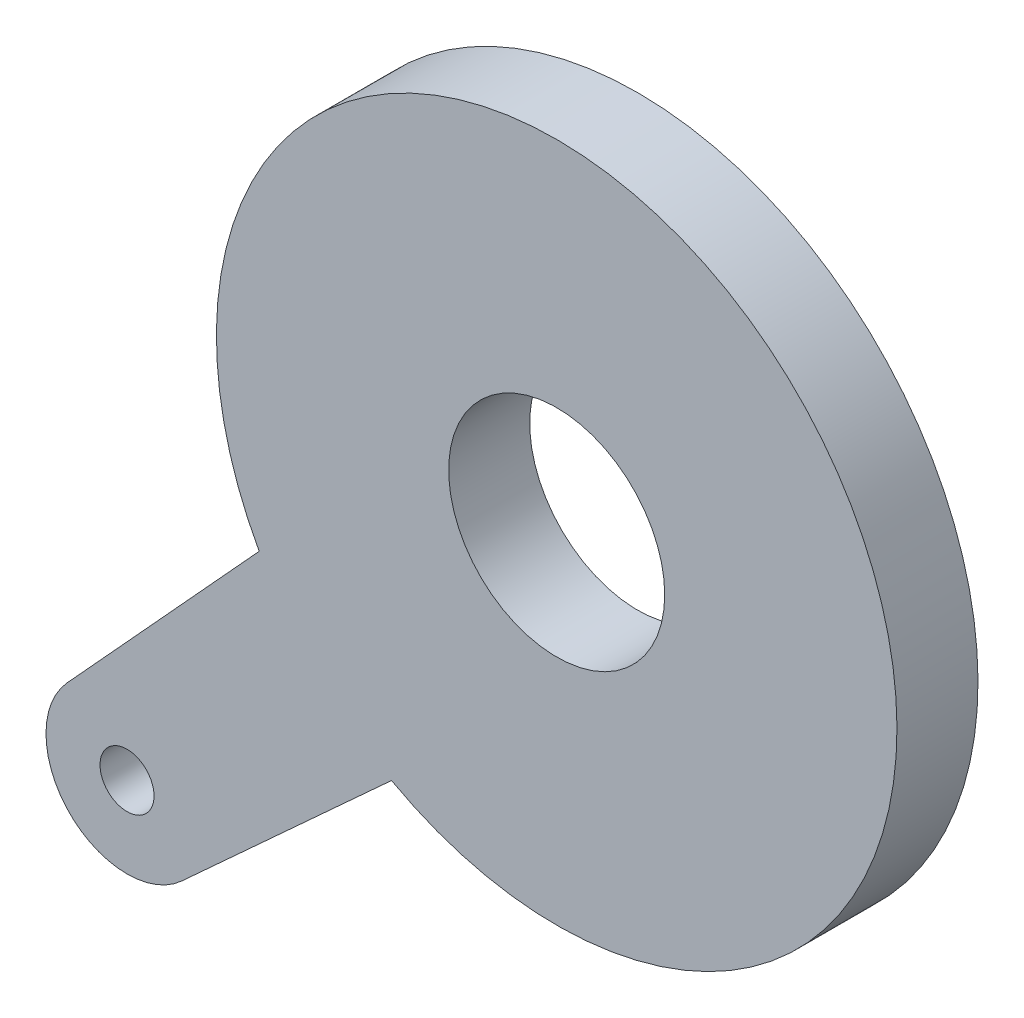
ISO-10303-21;
HEADER;
FILE_DESCRIPTION(('STEP AP214'),'2;1');
FILE_NAME('part.step','',(''),(''),'','','');
FILE_SCHEMA(('AUTOMOTIVE_DESIGN { 1 0 10303 214 1 1 1 1 }'));
ENDSEC;
DATA;
#1=APPLICATION_CONTEXT('core data for automotive mechanical design processes');
#2=APPLICATION_PROTOCOL_DEFINITION('international standard','automotive_design',2000,#1);
#3=PRODUCT_CONTEXT('',#1,'mechanical');
#4=PRODUCT('Part','Part','',(#3));
#5=PRODUCT_RELATED_PRODUCT_CATEGORY('part','',(#4));
#6=PRODUCT_DEFINITION_FORMATION('','',#4);
#7=PRODUCT_DEFINITION_CONTEXT('part definition',#1,'design');
#8=PRODUCT_DEFINITION('design','',#6,#7);
#9=PRODUCT_DEFINITION_SHAPE('','',#8);
#10=(LENGTH_UNIT() NAMED_UNIT(*) SI_UNIT(.MILLI.,.METRE.));
#11=(NAMED_UNIT(*) PLANE_ANGLE_UNIT() SI_UNIT($,.RADIAN.));
#12=(NAMED_UNIT(*) SI_UNIT($,.STERADIAN.) SOLID_ANGLE_UNIT());
#13=UNCERTAINTY_MEASURE_WITH_UNIT(LENGTH_MEASURE(1.E-05),#10,'distance_accuracy_value','');
#14=(GEOMETRIC_REPRESENTATION_CONTEXT(3) GLOBAL_UNCERTAINTY_ASSIGNED_CONTEXT((#13)) GLOBAL_UNIT_ASSIGNED_CONTEXT((#10,
#11,#12)) REPRESENTATION_CONTEXT('',''));
#15=CARTESIAN_POINT('',(0.,0.,0.));
#16=DIRECTION('',(0.,0.,1.));
#17=DIRECTION('',(1.,0.,0.));
#18=AXIS2_PLACEMENT_3D('',#15,#16,#17);
#19=CARTESIAN_POINT('',(-15.9099025766973,-15.9099025766973,3.));
#20=DIRECTION('',(0.,0.,1.));
#21=DIRECTION('',(1.,0.,0.));
#22=AXIS2_PLACEMENT_3D('',#19,#20,#21);
#23=PLANE('',#22);
#24=CARTESIAN_POINT('',(0.,0.,3.));
#25=DIRECTION('',(0.,0.,1.));
#26=DIRECTION('',(1.,0.,0.));
#27=AXIS2_PLACEMENT_3D('',#24,#25,#26);
#28=CIRCLE('',#27,4.);
#29=CARTESIAN_POINT('',(4.,0.,3.));
#30=VERTEX_POINT('',#29);
#31=EDGE_CURVE('E117',#30,#30,#28,.T.);
#32=ORIENTED_EDGE('',*,*,#31,.F.);
#33=EDGE_LOOP('',(#32));
#34=FACE_BOUND('',#33,.T.);
#35=CARTESIAN_POINT('',(-15.9099025766973,-15.9099025766973,3.));
#36=DIRECTION('',(0.,0.,1.));
#37=DIRECTION('',(1.,0.,0.));
#38=AXIS2_PLACEMENT_3D('',#35,#36,#37);
#39=CIRCLE('',#38,3.);
#40=CARTESIAN_POINT('',(-18.1234076575559,-13.8849593041552,3.));
#41=VERTEX_POINT('',#40);
#42=CARTESIAN_POINT('',(-13.8849593041552,-18.1234076575558,3.));
#43=VERTEX_POINT('',#42);
#44=EDGE_CURVE('E97',#41,#43,#39,.T.);
#45=ORIENTED_EDGE('',*,*,#44,.T.);
#46=DIRECTION('',(0.73783502695284,0.674981090847367,0.));
#47=VECTOR('',#46,1.);
#48=CARTESIAN_POINT('',(-6.11589206132728,-11.0161637739366,3.));
#49=LINE('',#48,#47);
#50=CARTESIAN_POINT('',(-6.11589206132728,-11.0161637739366,3.));
#51=VERTEX_POINT('',#50);
#52=EDGE_CURVE('E92',#43,#51,#49,.T.);
#53=ORIENTED_EDGE('',*,*,#52,.T.);
#54=CARTESIAN_POINT('',(0.,0.,3.));
#55=DIRECTION('',(0.,0.,1.));
#56=DIRECTION('',(1.,0.,0.));
#57=AXIS2_PLACEMENT_3D('',#54,#55,#56);
#58=CIRCLE('',#57,12.6);
#59=CARTESIAN_POINT('',(-11.0161637739367,-6.11589206132725,3.));
#60=VERTEX_POINT('',#59);
#61=EDGE_CURVE('E95',#51,#60,#58,.T.);
#62=ORIENTED_EDGE('',*,*,#61,.T.);
#63=DIRECTION('',(-0.674981090847369,-0.737835026952838,0.));
#64=VECTOR('',#63,1.);
#65=CARTESIAN_POINT('',(-11.0161637739367,-6.11589206132725,3.));
#66=LINE('',#65,#64);
#67=EDGE_CURVE('E62',#60,#41,#66,.T.);
#68=ORIENTED_EDGE('',*,*,#67,.T.);
#69=EDGE_LOOP('',(#45,#53,#62,#68));
#70=FACE_BOUND('',#69,.T.);
#71=CARTESIAN_POINT('',(-15.9099025766973,-15.9099025766973,3.));
#72=DIRECTION('',(0.,0.,1.));
#73=DIRECTION('',(1.,0.,0.));
#74=AXIS2_PLACEMENT_3D('',#71,#72,#73);
#75=CIRCLE('',#74,1.);
#76=CARTESIAN_POINT('',(-14.9099025766973,-15.9099025766973,3.));
#77=VERTEX_POINT('',#76);
#78=EDGE_CURVE('E139',#77,#77,#75,.T.);
#79=ORIENTED_EDGE('',*,*,#78,.F.);
#80=EDGE_LOOP('',(#79));
#81=FACE_BOUND('',#80,.T.);
#82=ADVANCED_FACE('F44',(#34,#70,#81),#23,.T.);
#83=CARTESIAN_POINT('',(-15.9099025766973,-15.9099025766973,0.));
#84=DIRECTION('',(0.,0.,1.));
#85=DIRECTION('',(1.,0.,0.));
#86=AXIS2_PLACEMENT_3D('',#83,#84,#85);
#87=PLANE('',#86);
#88=CARTESIAN_POINT('',(-15.9099025766973,-15.9099025766973,0.));
#89=DIRECTION('',(0.,0.,1.));
#90=DIRECTION('',(1.,0.,0.));
#91=AXIS2_PLACEMENT_3D('',#88,#89,#90);
#92=CIRCLE('',#91,3.);
#93=CARTESIAN_POINT('',(-18.1234076575559,-13.8849593041552,0.));
#94=VERTEX_POINT('',#93);
#95=CARTESIAN_POINT('',(-13.8849593041552,-18.1234076575558,0.));
#96=VERTEX_POINT('',#95);
#97=EDGE_CURVE('E113',#94,#96,#92,.T.);
#98=ORIENTED_EDGE('',*,*,#97,.F.);
#99=DIRECTION('',(-0.674981090847369,-0.737835026952838,0.));
#100=VECTOR('',#99,1.);
#101=CARTESIAN_POINT('',(-11.0161637739367,-6.11589206132725,0.));
#102=LINE('',#101,#100);
#103=CARTESIAN_POINT('',(-11.0161637739367,-6.11589206132725,0.));
#104=VERTEX_POINT('',#103);
#105=EDGE_CURVE('E85',#104,#94,#102,.T.);
#106=ORIENTED_EDGE('',*,*,#105,.F.);
#107=CARTESIAN_POINT('',(0.,0.,0.));
#108=DIRECTION('',(0.,0.,1.));
#109=DIRECTION('',(1.,0.,0.));
#110=AXIS2_PLACEMENT_3D('',#107,#108,#109);
#111=CIRCLE('',#110,12.6);
#112=CARTESIAN_POINT('',(-6.11589206132728,-11.0161637739366,0.));
#113=VERTEX_POINT('',#112);
#114=EDGE_CURVE('E79',#113,#104,#111,.T.);
#115=ORIENTED_EDGE('',*,*,#114,.F.);
#116=DIRECTION('',(0.73783502695284,0.674981090847367,0.));
#117=VECTOR('',#116,1.);
#118=CARTESIAN_POINT('',(-6.11589206132728,-11.0161637739366,0.));
#119=LINE('',#118,#117);
#120=EDGE_CURVE('E102',#96,#113,#119,.T.);
#121=ORIENTED_EDGE('',*,*,#120,.F.);
#122=EDGE_LOOP('',(#98,#106,#115,#121));
#123=FACE_BOUND('',#122,.T.);
#124=CARTESIAN_POINT('',(0.,0.,0.));
#125=DIRECTION('',(0.,0.,1.));
#126=DIRECTION('',(1.,0.,0.));
#127=AXIS2_PLACEMENT_3D('',#124,#125,#126);
#128=CIRCLE('',#127,4.);
#129=CARTESIAN_POINT('',(4.,0.,0.));
#130=VERTEX_POINT('',#129);
#131=EDGE_CURVE('E135',#130,#130,#128,.T.);
#132=ORIENTED_EDGE('',*,*,#131,.T.);
#133=EDGE_LOOP('',(#132));
#134=FACE_BOUND('',#133,.T.);
#135=CARTESIAN_POINT('',(-15.9099025766973,-15.9099025766973,0.));
#136=DIRECTION('',(0.,0.,1.));
#137=DIRECTION('',(1.,0.,0.));
#138=AXIS2_PLACEMENT_3D('',#135,#136,#137);
#139=CIRCLE('',#138,1.);
#140=CARTESIAN_POINT('',(-14.9099025766973,-15.9099025766973,0.));
#141=VERTEX_POINT('',#140);
#142=EDGE_CURVE('E143',#141,#141,#139,.T.);
#143=ORIENTED_EDGE('',*,*,#142,.T.);
#144=EDGE_LOOP('',(#143));
#145=FACE_BOUND('',#144,.T.);
#146=ADVANCED_FACE('F130',(#123,#134,#145),#87,.F.);
#147=CARTESIAN_POINT('',(-15.9099025766973,-15.9099025766973,3.));
#148=DIRECTION('',(0.,0.,-1.));
#149=DIRECTION('',(-1.,0.,0.));
#150=AXIS2_PLACEMENT_3D('',#147,#148,#149);
#151=CYLINDRICAL_SURFACE('',#150,3.);
#152=ORIENTED_EDGE('',*,*,#97,.T.);
#153=DIRECTION('',(0.,0.,-1.));
#154=VECTOR('',#153,1.);
#155=CARTESIAN_POINT('',(-13.8849593041552,-18.1234076575558,3.));
#156=LINE('',#155,#154);
#157=EDGE_CURVE('E11',#43,#96,#156,.T.);
#158=ORIENTED_EDGE('',*,*,#157,.F.);
#159=ORIENTED_EDGE('',*,*,#44,.F.);
#160=DIRECTION('',(0.,0.,-1.));
#161=VECTOR('',#160,1.);
#162=CARTESIAN_POINT('',(-18.1234076575559,-13.8849593041552,3.));
#163=LINE('',#162,#161);
#164=EDGE_CURVE('E109',#41,#94,#163,.T.);
#165=ORIENTED_EDGE('',*,*,#164,.T.);
#166=EDGE_LOOP('',(#152,#158,#159,#165));
#167=FACE_BOUND('',#166,.T.);
#168=ADVANCED_FACE('F46',(#167),#151,.T.);
#169=CARTESIAN_POINT('',(-6.11589206132728,-11.0161637739366,3.));
#170=DIRECTION('',(-0.674981090847367,0.73783502695284,0.));
#171=DIRECTION('',(-0.73783502695284,-0.674981090847367,0.));
#172=AXIS2_PLACEMENT_3D('',#169,#170,#171);
#173=PLANE('',#172);
#174=ORIENTED_EDGE('',*,*,#120,.T.);
#175=DIRECTION('',(0.,0.,-1.));
#176=VECTOR('',#175,1.);
#177=CARTESIAN_POINT('',(-6.11589206132728,-11.0161637739366,3.));
#178=LINE('',#177,#176);
#179=EDGE_CURVE('E54',#51,#113,#178,.T.);
#180=ORIENTED_EDGE('',*,*,#179,.F.);
#181=ORIENTED_EDGE('',*,*,#52,.F.);
#182=ORIENTED_EDGE('',*,*,#157,.T.);
#183=EDGE_LOOP('',(#174,#180,#181,#182));
#184=FACE_BOUND('',#183,.T.);
#185=ADVANCED_FACE('F101',(#184),#173,.F.);
#186=CARTESIAN_POINT('',(0.,0.,3.));
#187=DIRECTION('',(0.,0.,-1.));
#188=DIRECTION('',(-1.,0.,0.));
#189=AXIS2_PLACEMENT_3D('',#186,#187,#188);
#190=CYLINDRICAL_SURFACE('',#189,12.6);
#191=ORIENTED_EDGE('',*,*,#114,.T.);
#192=DIRECTION('',(0.,0.,-1.));
#193=VECTOR('',#192,1.);
#194=CARTESIAN_POINT('',(-11.0161637739367,-6.11589206132725,3.));
#195=LINE('',#194,#193);
#196=EDGE_CURVE('E104',#60,#104,#195,.T.);
#197=ORIENTED_EDGE('',*,*,#196,.F.);
#198=ORIENTED_EDGE('',*,*,#61,.F.);
#199=ORIENTED_EDGE('',*,*,#179,.T.);
#200=EDGE_LOOP('',(#191,#197,#198,#199));
#201=FACE_BOUND('',#200,.T.);
#202=ADVANCED_FACE('F105',(#201),#190,.T.);
#203=CARTESIAN_POINT('',(-11.0161637739367,-6.11589206132725,3.));
#204=DIRECTION('',(0.737835026952838,-0.674981090847369,0.));
#205=DIRECTION('',(0.674981090847369,0.737835026952838,0.));
#206=AXIS2_PLACEMENT_3D('',#203,#204,#205);
#207=PLANE('',#206);
#208=ORIENTED_EDGE('',*,*,#105,.T.);
#209=ORIENTED_EDGE('',*,*,#164,.F.);
#210=ORIENTED_EDGE('',*,*,#67,.F.);
#211=ORIENTED_EDGE('',*,*,#196,.T.);
#212=EDGE_LOOP('',(#208,#209,#210,#211));
#213=FACE_BOUND('',#212,.T.);
#214=ADVANCED_FACE('F127',(#213),#207,.F.);
#215=CARTESIAN_POINT('',(0.,0.,3.));
#216=DIRECTION('',(0.,0.,-1.));
#217=DIRECTION('',(-1.,0.,0.));
#218=AXIS2_PLACEMENT_3D('',#215,#216,#217);
#219=CYLINDRICAL_SURFACE('',#218,4.);
#220=ORIENTED_EDGE('',*,*,#31,.T.);
#221=EDGE_LOOP('',(#220));
#222=FACE_BOUND('',#221,.T.);
#223=ORIENTED_EDGE('',*,*,#131,.F.);
#224=EDGE_LOOP('',(#223));
#225=FACE_BOUND('',#224,.T.);
#226=ADVANCED_FACE('F162',(#222,#225),#219,.F.);
#227=CARTESIAN_POINT('',(-15.9099025766973,-15.9099025766973,3.));
#228=DIRECTION('',(0.,0.,-1.));
#229=DIRECTION('',(-1.,0.,0.));
#230=AXIS2_PLACEMENT_3D('',#227,#228,#229);
#231=CYLINDRICAL_SURFACE('',#230,1.);
#232=ORIENTED_EDGE('',*,*,#78,.T.);
#233=EDGE_LOOP('',(#232));
#234=FACE_BOUND('',#233,.T.);
#235=ORIENTED_EDGE('',*,*,#142,.F.);
#236=EDGE_LOOP('',(#235));
#237=FACE_BOUND('',#236,.T.);
#238=ADVANCED_FACE('F151',(#234,#237),#231,.F.);
#239=CLOSED_SHELL('',(#82,#146,#168,#185,#202,#214,#226,#238));
#240=MANIFOLD_SOLID_BREP('B2',#239);
#241=ADVANCED_BREP_SHAPE_REPRESENTATION('',(#18,#240),#14);
#242=SHAPE_DEFINITION_REPRESENTATION(#9,#241);
ENDSEC;
END-ISO-10303-21;
